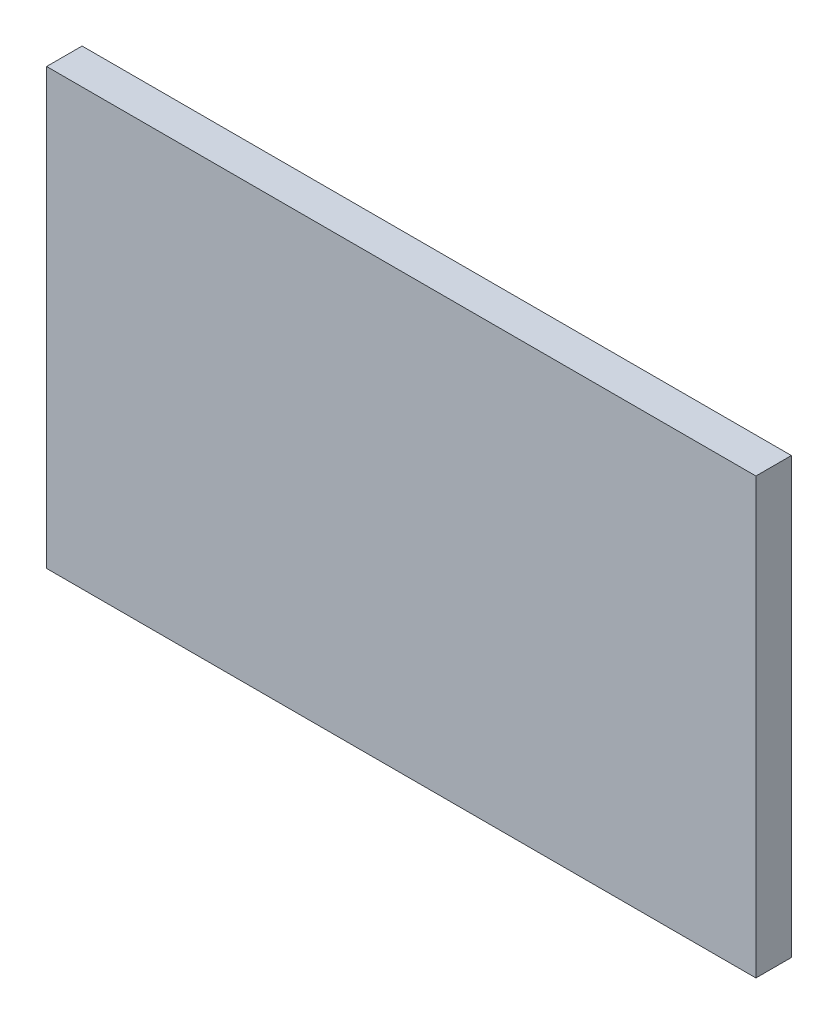
ISO-10303-21;
HEADER;
FILE_DESCRIPTION(('STEP AP214'),'2;1');
FILE_NAME('part.step','',(''),(''),'','','');
FILE_SCHEMA(('AUTOMOTIVE_DESIGN { 1 0 10303 214 1 1 1 1 }'));
ENDSEC;
DATA;
#1=APPLICATION_CONTEXT('core data for automotive mechanical design processes');
#2=APPLICATION_PROTOCOL_DEFINITION('international standard','automotive_design',2000,#1);
#3=PRODUCT_CONTEXT('',#1,'mechanical');
#4=PRODUCT('Part','Part','',(#3));
#5=PRODUCT_RELATED_PRODUCT_CATEGORY('part','',(#4));
#6=PRODUCT_DEFINITION_FORMATION('','',#4);
#7=PRODUCT_DEFINITION_CONTEXT('part definition',#1,'design');
#8=PRODUCT_DEFINITION('design','',#6,#7);
#9=PRODUCT_DEFINITION_SHAPE('','',#8);
#10=(LENGTH_UNIT() NAMED_UNIT(*) SI_UNIT(.MILLI.,.METRE.));
#11=(NAMED_UNIT(*) PLANE_ANGLE_UNIT() SI_UNIT($,.RADIAN.));
#12=(NAMED_UNIT(*) SI_UNIT($,.STERADIAN.) SOLID_ANGLE_UNIT());
#13=UNCERTAINTY_MEASURE_WITH_UNIT(LENGTH_MEASURE(1.E-05),#10,'distance_accuracy_value','');
#14=(GEOMETRIC_REPRESENTATION_CONTEXT(3) GLOBAL_UNCERTAINTY_ASSIGNED_CONTEXT((#13)) GLOBAL_UNIT_ASSIGNED_CONTEXT((#10,
#11,#12)) REPRESENTATION_CONTEXT('',''));
#15=CARTESIAN_POINT('',(0.,0.,0.));
#16=DIRECTION('',(0.,0.,1.));
#17=DIRECTION('',(1.,0.,0.));
#18=AXIS2_PLACEMENT_3D('',#15,#16,#17);
#19=CARTESIAN_POINT('',(-0.0025065,-15.,3.143478));
#20=DIRECTION('',(0.,1.,0.));
#21=DIRECTION('',(0.,0.,-1.));
#22=AXIS2_PLACEMENT_3D('',#19,#20,#21);
#23=PLANE('',#22);
#24=DIRECTION('',(1.,0.,0.));
#25=VECTOR('',#24,1.);
#26=CARTESIAN_POINT('',(-8.16003,-15.,3.551354));
#27=LINE('',#26,#25);
#28=CARTESIAN_POINT('',(-8.16003,-15.,3.551354));
#29=VERTEX_POINT('',#28);
#30=CARTESIAN_POINT('',(8.155017,-15.,3.551354));
#31=VERTEX_POINT('',#30);
#32=EDGE_CURVE('E94',#29,#31,#27,.T.);
#33=ORIENTED_EDGE('',*,*,#32,.T.);
#34=DIRECTION('',(0.,0.,-1.));
#35=VECTOR('',#34,1.);
#36=CARTESIAN_POINT('',(8.155017,-15.,3.551354));
#37=LINE('',#36,#35);
#38=CARTESIAN_POINT('',(8.155017,-15.,2.735602));
#39=VERTEX_POINT('',#38);
#40=EDGE_CURVE('E73',#31,#39,#37,.T.);
#41=ORIENTED_EDGE('',*,*,#40,.T.);
#42=DIRECTION('',(-1.,0.,0.));
#43=VECTOR('',#42,1.);
#44=CARTESIAN_POINT('',(8.155017,-15.,2.735602));
#45=LINE('',#44,#43);
#46=CARTESIAN_POINT('',(-8.16003,-15.,2.735602));
#47=VERTEX_POINT('',#46);
#48=EDGE_CURVE('E87',#39,#47,#45,.T.);
#49=ORIENTED_EDGE('',*,*,#48,.T.);
#50=DIRECTION('',(0.,0.,1.));
#51=VECTOR('',#50,1.);
#52=CARTESIAN_POINT('',(-8.16003,-15.,2.735602));
#53=LINE('',#52,#51);
#54=EDGE_CURVE('E11',#47,#29,#53,.T.);
#55=ORIENTED_EDGE('',*,*,#54,.T.);
#56=EDGE_LOOP('',(#33,#41,#49,#55));
#57=FACE_BOUND('',#56,.T.);
#58=ADVANCED_FACE('F18',(#57),#23,.T.);
#59=CARTESIAN_POINT('',(-0.0025065,-25.,3.143478));
#60=DIRECTION('',(0.,1.,0.));
#61=DIRECTION('',(0.,0.,-1.));
#62=AXIS2_PLACEMENT_3D('',#59,#60,#61);
#63=PLANE('',#62);
#64=DIRECTION('',(0.,0.,1.));
#65=VECTOR('',#64,1.);
#66=CARTESIAN_POINT('',(-8.16003,-25.,2.735602));
#67=LINE('',#66,#65);
#68=CARTESIAN_POINT('',(-8.16003,-25.,2.735602));
#69=VERTEX_POINT('',#68);
#70=CARTESIAN_POINT('',(-8.16003,-25.,3.551354));
#71=VERTEX_POINT('',#70);
#72=EDGE_CURVE('E26',#69,#71,#67,.T.);
#73=ORIENTED_EDGE('',*,*,#72,.F.);
#74=DIRECTION('',(-1.,0.,0.));
#75=VECTOR('',#74,1.);
#76=CARTESIAN_POINT('',(8.155017,-25.,2.735602));
#77=LINE('',#76,#75);
#78=CARTESIAN_POINT('',(8.155017,-25.,2.735602));
#79=VERTEX_POINT('',#78);
#80=EDGE_CURVE('E58',#79,#69,#77,.T.);
#81=ORIENTED_EDGE('',*,*,#80,.F.);
#82=DIRECTION('',(0.,0.,-1.));
#83=VECTOR('',#82,1.);
#84=CARTESIAN_POINT('',(8.155017,-25.,3.551354));
#85=LINE('',#84,#83);
#86=CARTESIAN_POINT('',(8.155017,-25.,3.551354));
#87=VERTEX_POINT('',#86);
#88=EDGE_CURVE('E96',#87,#79,#85,.T.);
#89=ORIENTED_EDGE('',*,*,#88,.F.);
#90=DIRECTION('',(1.,0.,0.));
#91=VECTOR('',#90,1.);
#92=CARTESIAN_POINT('',(-8.16003,-25.,3.551354));
#93=LINE('',#92,#91);
#94=EDGE_CURVE('E93',#71,#87,#93,.T.);
#95=ORIENTED_EDGE('',*,*,#94,.F.);
#96=EDGE_LOOP('',(#73,#81,#89,#95));
#97=FACE_BOUND('',#96,.T.);
#98=ADVANCED_FACE('F98',(#97),#63,.F.);
#99=CARTESIAN_POINT('',(-8.16003,-25.,2.735602));
#100=DIRECTION('',(1.,0.,0.));
#101=DIRECTION('',(0.,1.,0.));
#102=AXIS2_PLACEMENT_3D('',#99,#100,#101);
#103=PLANE('',#102);
#104=ORIENTED_EDGE('',*,*,#72,.T.);
#105=DIRECTION('',(0.,1.,0.));
#106=VECTOR('',#105,1.);
#107=CARTESIAN_POINT('',(-8.16003,-25.,3.551354));
#108=LINE('',#107,#106);
#109=EDGE_CURVE('E82',#71,#29,#108,.T.);
#110=ORIENTED_EDGE('',*,*,#109,.T.);
#111=ORIENTED_EDGE('',*,*,#54,.F.);
#112=DIRECTION('',(0.,1.,0.));
#113=VECTOR('',#112,1.);
#114=CARTESIAN_POINT('',(-8.16003,-25.,2.735602));
#115=LINE('',#114,#113);
#116=EDGE_CURVE('E85',#69,#47,#115,.T.);
#117=ORIENTED_EDGE('',*,*,#116,.F.);
#118=EDGE_LOOP('',(#104,#110,#111,#117));
#119=FACE_BOUND('',#118,.T.);
#120=ADVANCED_FACE('F81',(#119),#103,.F.);
#121=CARTESIAN_POINT('',(8.155017,-25.,2.735602));
#122=DIRECTION('',(0.,0.,1.));
#123=DIRECTION('',(0.,-1.,0.));
#124=AXIS2_PLACEMENT_3D('',#121,#122,#123);
#125=PLANE('',#124);
#126=ORIENTED_EDGE('',*,*,#80,.T.);
#127=ORIENTED_EDGE('',*,*,#116,.T.);
#128=ORIENTED_EDGE('',*,*,#48,.F.);
#129=DIRECTION('',(0.,1.,0.));
#130=VECTOR('',#129,1.);
#131=CARTESIAN_POINT('',(8.155017,-25.,2.735602));
#132=LINE('',#131,#130);
#133=EDGE_CURVE('E115',#79,#39,#132,.T.);
#134=ORIENTED_EDGE('',*,*,#133,.F.);
#135=EDGE_LOOP('',(#126,#127,#128,#134));
#136=FACE_BOUND('',#135,.T.);
#137=ADVANCED_FACE('F124',(#136),#125,.F.);
#138=CARTESIAN_POINT('',(8.155017,-25.,3.551354));
#139=DIRECTION('',(-1.,0.,0.));
#140=DIRECTION('',(0.,0.,1.));
#141=AXIS2_PLACEMENT_3D('',#138,#139,#140);
#142=PLANE('',#141);
#143=ORIENTED_EDGE('',*,*,#88,.T.);
#144=ORIENTED_EDGE('',*,*,#133,.T.);
#145=ORIENTED_EDGE('',*,*,#40,.F.);
#146=DIRECTION('',(0.,1.,0.));
#147=VECTOR('',#146,1.);
#148=CARTESIAN_POINT('',(8.155017,-25.,3.551354));
#149=LINE('',#148,#147);
#150=EDGE_CURVE('E101',#87,#31,#149,.T.);
#151=ORIENTED_EDGE('',*,*,#150,.F.);
#152=EDGE_LOOP('',(#143,#144,#145,#151));
#153=FACE_BOUND('',#152,.T.);
#154=ADVANCED_FACE('F125',(#153),#142,.F.);
#155=CARTESIAN_POINT('',(-8.16003,-25.,3.551354));
#156=DIRECTION('',(0.,0.,-1.));
#157=DIRECTION('',(0.,-1.,0.));
#158=AXIS2_PLACEMENT_3D('',#155,#156,#157);
#159=PLANE('',#158);
#160=ORIENTED_EDGE('',*,*,#94,.T.);
#161=ORIENTED_EDGE('',*,*,#150,.T.);
#162=ORIENTED_EDGE('',*,*,#32,.F.);
#163=ORIENTED_EDGE('',*,*,#109,.F.);
#164=EDGE_LOOP('',(#160,#161,#162,#163));
#165=FACE_BOUND('',#164,.T.);
#166=ADVANCED_FACE('F91',(#165),#159,.F.);
#167=CLOSED_SHELL('',(#58,#98,#120,#137,#154,#166));
#168=MANIFOLD_SOLID_BREP('B1',#167);
#169=ADVANCED_BREP_SHAPE_REPRESENTATION('',(#18,#168),#14);
#170=SHAPE_DEFINITION_REPRESENTATION(#9,#169);
ENDSEC;
END-ISO-10303-21;
